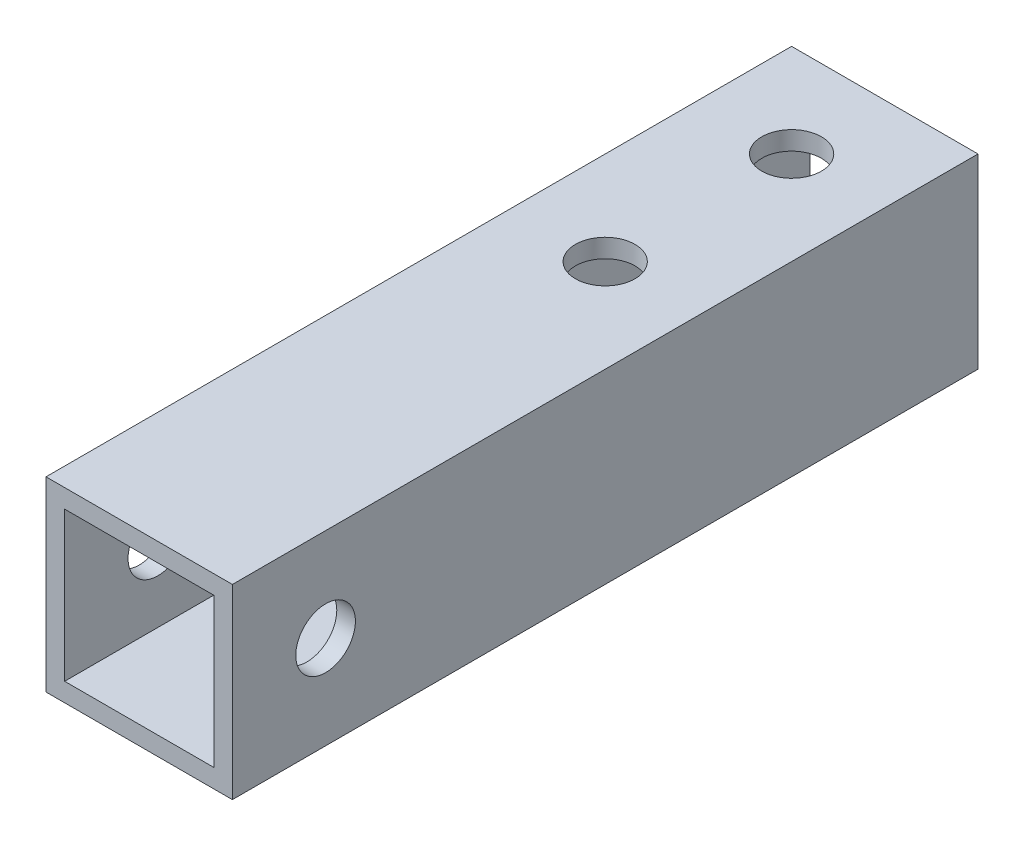
ISO-10303-21;
HEADER;
FILE_DESCRIPTION(('STEP AP214'),'2;1');
FILE_NAME('part.step','',(''),(''),'','','');
FILE_SCHEMA(('AUTOMOTIVE_DESIGN { 1 0 10303 214 1 1 1 1 }'));
ENDSEC;
DATA;
#1=APPLICATION_CONTEXT('core data for automotive mechanical design processes');
#2=APPLICATION_PROTOCOL_DEFINITION('international standard','automotive_design',2000,#1);
#3=PRODUCT_CONTEXT('',#1,'mechanical');
#4=PRODUCT('Part','Part','',(#3));
#5=PRODUCT_RELATED_PRODUCT_CATEGORY('part','',(#4));
#6=PRODUCT_DEFINITION_FORMATION('','',#4);
#7=PRODUCT_DEFINITION_CONTEXT('part definition',#1,'design');
#8=PRODUCT_DEFINITION('design','',#6,#7);
#9=PRODUCT_DEFINITION_SHAPE('','',#8);
#10=(LENGTH_UNIT() NAMED_UNIT(*) SI_UNIT(.MILLI.,.METRE.));
#11=(NAMED_UNIT(*) PLANE_ANGLE_UNIT() SI_UNIT($,.RADIAN.));
#12=(NAMED_UNIT(*) SI_UNIT($,.STERADIAN.) SOLID_ANGLE_UNIT());
#13=UNCERTAINTY_MEASURE_WITH_UNIT(LENGTH_MEASURE(1.E-05),#10,'distance_accuracy_value','');
#14=(GEOMETRIC_REPRESENTATION_CONTEXT(3) GLOBAL_UNCERTAINTY_ASSIGNED_CONTEXT((#13)) GLOBAL_UNIT_ASSIGNED_CONTEXT((#10,
#11,#12)) REPRESENTATION_CONTEXT('',''));
#15=CARTESIAN_POINT('',(0.,0.,0.));
#16=DIRECTION('',(0.,0.,1.));
#17=DIRECTION('',(1.,0.,0.));
#18=AXIS2_PLACEMENT_3D('',#15,#16,#17);
#19=CARTESIAN_POINT('',(0.,0.,40.));
#20=DIRECTION('',(0.,0.,1.));
#21=DIRECTION('',(1.,0.,0.));
#22=AXIS2_PLACEMENT_3D('',#19,#20,#21);
#23=PLANE('',#22);
#24=DIRECTION('',(0.,1.,0.));
#25=VECTOR('',#24,1.);
#26=CARTESIAN_POINT('',(5.,-5.,40.));
#27=LINE('',#26,#25);
#28=CARTESIAN_POINT('',(5.,-5.,40.));
#29=VERTEX_POINT('',#28);
#30=CARTESIAN_POINT('',(5.,5.,40.));
#31=VERTEX_POINT('',#30);
#32=EDGE_CURVE('E164',#29,#31,#27,.T.);
#33=ORIENTED_EDGE('',*,*,#32,.T.);
#34=DIRECTION('',(-1.,0.,0.));
#35=VECTOR('',#34,1.);
#36=CARTESIAN_POINT('',(-5.,5.,40.));
#37=LINE('',#36,#35);
#38=CARTESIAN_POINT('',(-5.,5.,40.));
#39=VERTEX_POINT('',#38);
#40=EDGE_CURVE('E167',#31,#39,#37,.T.);
#41=ORIENTED_EDGE('',*,*,#40,.T.);
#42=DIRECTION('',(0.,-1.,0.));
#43=VECTOR('',#42,1.);
#44=CARTESIAN_POINT('',(-5.,-5.,40.));
#45=LINE('',#44,#43);
#46=CARTESIAN_POINT('',(-5.,-5.,40.));
#47=VERTEX_POINT('',#46);
#48=EDGE_CURVE('E170',#39,#47,#45,.T.);
#49=ORIENTED_EDGE('',*,*,#48,.T.);
#50=DIRECTION('',(1.,0.,0.));
#51=VECTOR('',#50,1.);
#52=CARTESIAN_POINT('',(-5.,-5.,40.));
#53=LINE('',#52,#51);
#54=EDGE_CURVE('E172',#47,#29,#53,.T.);
#55=ORIENTED_EDGE('',*,*,#54,.T.);
#56=EDGE_LOOP('',(#33,#41,#49,#55));
#57=FACE_BOUND('',#56,.T.);
#58=DIRECTION('',(-1.,0.,0.));
#59=VECTOR('',#58,1.);
#60=CARTESIAN_POINT('',(0.,4.,40.));
#61=LINE('',#60,#59);
#62=CARTESIAN_POINT('',(4.,4.,40.));
#63=VERTEX_POINT('',#62);
#64=CARTESIAN_POINT('',(-4.,4.,40.));
#65=VERTEX_POINT('',#64);
#66=EDGE_CURVE('E134',#63,#65,#61,.T.);
#67=ORIENTED_EDGE('',*,*,#66,.F.);
#68=DIRECTION('',(0.,1.,0.));
#69=VECTOR('',#68,1.);
#70=CARTESIAN_POINT('',(4.,0.,40.));
#71=LINE('',#70,#69);
#72=CARTESIAN_POINT('',(4.,-4.,40.));
#73=VERTEX_POINT('',#72);
#74=EDGE_CURVE('E126',#73,#63,#71,.T.);
#75=ORIENTED_EDGE('',*,*,#74,.F.);
#76=DIRECTION('',(1.,0.,0.));
#77=VECTOR('',#76,1.);
#78=CARTESIAN_POINT('',(0.,-4.,40.));
#79=LINE('',#78,#77);
#80=CARTESIAN_POINT('',(-4.,-4.,40.));
#81=VERTEX_POINT('',#80);
#82=EDGE_CURVE('E148',#81,#73,#79,.T.);
#83=ORIENTED_EDGE('',*,*,#82,.F.);
#84=DIRECTION('',(0.,-1.,0.));
#85=VECTOR('',#84,1.);
#86=CARTESIAN_POINT('',(-4.,0.,40.));
#87=LINE('',#86,#85);
#88=EDGE_CURVE('E146',#65,#81,#87,.T.);
#89=ORIENTED_EDGE('',*,*,#88,.F.);
#90=EDGE_LOOP('',(#67,#75,#83,#89));
#91=FACE_BOUND('',#90,.T.);
#92=ADVANCED_FACE('F59',(#57,#91),#23,.T.);
#93=CARTESIAN_POINT('',(0.,0.,0.));
#94=DIRECTION('',(0.,0.,1.));
#95=DIRECTION('',(1.,0.,0.));
#96=AXIS2_PLACEMENT_3D('',#93,#94,#95);
#97=PLANE('',#96);
#98=DIRECTION('',(0.,1.,0.));
#99=VECTOR('',#98,1.);
#100=CARTESIAN_POINT('',(5.,-5.,0.));
#101=LINE('',#100,#99);
#102=CARTESIAN_POINT('',(5.,-5.,0.));
#103=VERTEX_POINT('',#102);
#104=CARTESIAN_POINT('',(5.,5.,0.));
#105=VERTEX_POINT('',#104);
#106=EDGE_CURVE('E142',#103,#105,#101,.T.);
#107=ORIENTED_EDGE('',*,*,#106,.F.);
#108=DIRECTION('',(1.,0.,0.));
#109=VECTOR('',#108,1.);
#110=CARTESIAN_POINT('',(-5.,-5.,0.));
#111=LINE('',#110,#109);
#112=CARTESIAN_POINT('',(-5.,-5.,0.));
#113=VERTEX_POINT('',#112);
#114=EDGE_CURVE('E168',#113,#103,#111,.T.);
#115=ORIENTED_EDGE('',*,*,#114,.F.);
#116=DIRECTION('',(0.,-1.,0.));
#117=VECTOR('',#116,1.);
#118=CARTESIAN_POINT('',(-5.,-5.,0.));
#119=LINE('',#118,#117);
#120=CARTESIAN_POINT('',(-5.,5.,0.));
#121=VERTEX_POINT('',#120);
#122=EDGE_CURVE('E179',#121,#113,#119,.T.);
#123=ORIENTED_EDGE('',*,*,#122,.F.);
#124=DIRECTION('',(-1.,0.,0.));
#125=VECTOR('',#124,1.);
#126=CARTESIAN_POINT('',(-5.,5.,0.));
#127=LINE('',#126,#125);
#128=EDGE_CURVE('E177',#105,#121,#127,.T.);
#129=ORIENTED_EDGE('',*,*,#128,.F.);
#130=EDGE_LOOP('',(#107,#115,#123,#129));
#131=FACE_BOUND('',#130,.T.);
#132=DIRECTION('',(0.,1.,0.));
#133=VECTOR('',#132,1.);
#134=CARTESIAN_POINT('',(4.,0.,0.));
#135=LINE('',#134,#133);
#136=CARTESIAN_POINT('',(4.,-4.,0.));
#137=VERTEX_POINT('',#136);
#138=CARTESIAN_POINT('',(4.,4.,0.));
#139=VERTEX_POINT('',#138);
#140=EDGE_CURVE('E84',#137,#139,#135,.T.);
#141=ORIENTED_EDGE('',*,*,#140,.T.);
#142=DIRECTION('',(-1.,0.,0.));
#143=VECTOR('',#142,1.);
#144=CARTESIAN_POINT('',(0.,4.,0.));
#145=LINE('',#144,#143);
#146=CARTESIAN_POINT('',(-4.,4.,0.));
#147=VERTEX_POINT('',#146);
#148=EDGE_CURVE('E141',#139,#147,#145,.T.);
#149=ORIENTED_EDGE('',*,*,#148,.T.);
#150=DIRECTION('',(0.,-1.,0.));
#151=VECTOR('',#150,1.);
#152=CARTESIAN_POINT('',(-4.,0.,0.));
#153=LINE('',#152,#151);
#154=CARTESIAN_POINT('',(-4.,-4.,0.));
#155=VERTEX_POINT('',#154);
#156=EDGE_CURVE('E156',#147,#155,#153,.T.);
#157=ORIENTED_EDGE('',*,*,#156,.T.);
#158=DIRECTION('',(1.,0.,0.));
#159=VECTOR('',#158,1.);
#160=CARTESIAN_POINT('',(0.,-4.,0.));
#161=LINE('',#160,#159);
#162=EDGE_CURVE('E135',#155,#137,#161,.T.);
#163=ORIENTED_EDGE('',*,*,#162,.T.);
#164=EDGE_LOOP('',(#141,#149,#157,#163));
#165=FACE_BOUND('',#164,.T.);
#166=ADVANCED_FACE('F237',(#131,#165),#97,.F.);
#167=CARTESIAN_POINT('',(5.,-5.,40.));
#168=DIRECTION('',(-1.,0.,0.));
#169=DIRECTION('',(0.,0.,1.));
#170=AXIS2_PLACEMENT_3D('',#167,#168,#169);
#171=PLANE('',#170);
#172=CARTESIAN_POINT('',(5.,0.,35.));
#173=DIRECTION('',(1.,0.,0.));
#174=DIRECTION('',(0.,0.,-1.));
#175=AXIS2_PLACEMENT_3D('',#172,#173,#174);
#176=CIRCLE('',#175,1.60000000000001);
#177=CARTESIAN_POINT('',(5.,0.,33.4));
#178=VERTEX_POINT('',#177);
#179=EDGE_CURVE('E217',#178,#178,#176,.T.);
#180=ORIENTED_EDGE('',*,*,#179,.F.);
#181=EDGE_LOOP('',(#180));
#182=FACE_BOUND('',#181,.T.);
#183=ORIENTED_EDGE('',*,*,#106,.T.);
#184=DIRECTION('',(0.,0.,-1.));
#185=VECTOR('',#184,1.);
#186=CARTESIAN_POINT('',(5.,5.,40.));
#187=LINE('',#186,#185);
#188=EDGE_CURVE('E12',#31,#105,#187,.T.);
#189=ORIENTED_EDGE('',*,*,#188,.F.);
#190=ORIENTED_EDGE('',*,*,#32,.F.);
#191=DIRECTION('',(0.,0.,-1.));
#192=VECTOR('',#191,1.);
#193=CARTESIAN_POINT('',(5.,-5.,40.));
#194=LINE('',#193,#192);
#195=EDGE_CURVE('E174',#29,#103,#194,.T.);
#196=ORIENTED_EDGE('',*,*,#195,.T.);
#197=EDGE_LOOP('',(#183,#189,#190,#196));
#198=FACE_BOUND('',#197,.T.);
#199=ADVANCED_FACE('F61',(#182,#198),#171,.F.);
#200=CARTESIAN_POINT('',(-5.,5.,40.));
#201=DIRECTION('',(0.,-1.,0.));
#202=DIRECTION('',(0.,0.,-1.));
#203=AXIS2_PLACEMENT_3D('',#200,#201,#202);
#204=PLANE('',#203);
#205=CARTESIAN_POINT('',(0.,5.,5.));
#206=DIRECTION('',(0.,1.,0.));
#207=DIRECTION('',(0.,0.,1.));
#208=AXIS2_PLACEMENT_3D('',#205,#206,#207);
#209=CIRCLE('',#208,1.6);
#210=CARTESIAN_POINT('',(0.,5.,6.6));
#211=VERTEX_POINT('',#210);
#212=EDGE_CURVE('E210',#211,#211,#209,.T.);
#213=ORIENTED_EDGE('',*,*,#212,.F.);
#214=EDGE_LOOP('',(#213));
#215=FACE_BOUND('',#214,.T.);
#216=CARTESIAN_POINT('',(0.,5.,15.));
#217=DIRECTION('',(0.,1.,0.));
#218=DIRECTION('',(0.,0.,1.));
#219=AXIS2_PLACEMENT_3D('',#216,#217,#218);
#220=CIRCLE('',#219,1.6);
#221=CARTESIAN_POINT('',(0.,5.,16.6));
#222=VERTEX_POINT('',#221);
#223=EDGE_CURVE('E203',#222,#222,#220,.T.);
#224=ORIENTED_EDGE('',*,*,#223,.F.);
#225=EDGE_LOOP('',(#224));
#226=FACE_BOUND('',#225,.T.);
#227=ORIENTED_EDGE('',*,*,#128,.T.);
#228=DIRECTION('',(0.,0.,-1.));
#229=VECTOR('',#228,1.);
#230=CARTESIAN_POINT('',(-5.,5.,40.));
#231=LINE('',#230,#229);
#232=EDGE_CURVE('E68',#39,#121,#231,.T.);
#233=ORIENTED_EDGE('',*,*,#232,.F.);
#234=ORIENTED_EDGE('',*,*,#40,.F.);
#235=ORIENTED_EDGE('',*,*,#188,.T.);
#236=EDGE_LOOP('',(#227,#233,#234,#235));
#237=FACE_BOUND('',#236,.T.);
#238=ADVANCED_FACE('F267',(#215,#226,#237),#204,.F.);
#239=CARTESIAN_POINT('',(-5.,-5.,40.));
#240=DIRECTION('',(1.,0.,0.));
#241=DIRECTION('',(0.,0.,-1.));
#242=AXIS2_PLACEMENT_3D('',#239,#240,#241);
#243=PLANE('',#242);
#244=CARTESIAN_POINT('',(-5.,0.,35.));
#245=DIRECTION('',(1.,0.,0.));
#246=DIRECTION('',(0.,0.,-1.));
#247=AXIS2_PLACEMENT_3D('',#244,#245,#246);
#248=CIRCLE('',#247,1.60000000000001);
#249=CARTESIAN_POINT('',(-5.,0.,33.4));
#250=VERTEX_POINT('',#249);
#251=EDGE_CURVE('E220',#250,#250,#248,.T.);
#252=ORIENTED_EDGE('',*,*,#251,.T.);
#253=EDGE_LOOP('',(#252));
#254=FACE_BOUND('',#253,.T.);
#255=ORIENTED_EDGE('',*,*,#122,.T.);
#256=DIRECTION('',(0.,0.,-1.));
#257=VECTOR('',#256,1.);
#258=CARTESIAN_POINT('',(-5.,-5.,40.));
#259=LINE('',#258,#257);
#260=EDGE_CURVE('E184',#47,#113,#259,.T.);
#261=ORIENTED_EDGE('',*,*,#260,.F.);
#262=ORIENTED_EDGE('',*,*,#48,.F.);
#263=ORIENTED_EDGE('',*,*,#232,.T.);
#264=EDGE_LOOP('',(#255,#261,#262,#263));
#265=FACE_BOUND('',#264,.T.);
#266=ADVANCED_FACE('F264',(#254,#265),#243,.F.);
#267=CARTESIAN_POINT('',(-5.,-5.,40.));
#268=DIRECTION('',(0.,1.,0.));
#269=DIRECTION('',(0.,0.,1.));
#270=AXIS2_PLACEMENT_3D('',#267,#268,#269);
#271=PLANE('',#270);
#272=CARTESIAN_POINT('',(0.,-5.,5.));
#273=DIRECTION('',(0.,1.,0.));
#274=DIRECTION('',(0.,0.,1.));
#275=AXIS2_PLACEMENT_3D('',#272,#273,#274);
#276=CIRCLE('',#275,1.6);
#277=CARTESIAN_POINT('',(0.,-5.,6.6));
#278=VERTEX_POINT('',#277);
#279=EDGE_CURVE('E192',#278,#278,#276,.T.);
#280=ORIENTED_EDGE('',*,*,#279,.T.);
#281=EDGE_LOOP('',(#280));
#282=FACE_BOUND('',#281,.T.);
#283=CARTESIAN_POINT('',(0.,-5.,15.));
#284=DIRECTION('',(0.,1.,0.));
#285=DIRECTION('',(0.,0.,1.));
#286=AXIS2_PLACEMENT_3D('',#283,#284,#285);
#287=CIRCLE('',#286,1.6);
#288=CARTESIAN_POINT('',(0.,-5.,16.6));
#289=VERTEX_POINT('',#288);
#290=EDGE_CURVE('E206',#289,#289,#287,.T.);
#291=ORIENTED_EDGE('',*,*,#290,.T.);
#292=EDGE_LOOP('',(#291));
#293=FACE_BOUND('',#292,.T.);
#294=ORIENTED_EDGE('',*,*,#114,.T.);
#295=ORIENTED_EDGE('',*,*,#195,.F.);
#296=ORIENTED_EDGE('',*,*,#54,.F.);
#297=ORIENTED_EDGE('',*,*,#260,.T.);
#298=EDGE_LOOP('',(#294,#295,#296,#297));
#299=FACE_BOUND('',#298,.T.);
#300=ADVANCED_FACE('F261',(#282,#293,#299),#271,.F.);
#301=CARTESIAN_POINT('',(4.,0.,40.));
#302=DIRECTION('',(-1.,0.,0.));
#303=DIRECTION('',(0.,0.,1.));
#304=AXIS2_PLACEMENT_3D('',#301,#302,#303);
#305=PLANE('',#304);
#306=CARTESIAN_POINT('',(4.,0.,35.));
#307=DIRECTION('',(-1.,0.,0.));
#308=DIRECTION('',(0.,0.,1.));
#309=AXIS2_PLACEMENT_3D('',#306,#307,#308);
#310=CIRCLE('',#309,1.60000000000001);
#311=CARTESIAN_POINT('',(4.,0.,36.6));
#312=VERTEX_POINT('',#311);
#313=EDGE_CURVE('E207',#312,#312,#310,.T.);
#314=ORIENTED_EDGE('',*,*,#313,.F.);
#315=EDGE_LOOP('',(#314));
#316=FACE_BOUND('',#315,.T.);
#317=ORIENTED_EDGE('',*,*,#140,.F.);
#318=DIRECTION('',(0.,0.,-1.));
#319=VECTOR('',#318,1.);
#320=CARTESIAN_POINT('',(4.,-4.,40.));
#321=LINE('',#320,#319);
#322=EDGE_CURVE('E130',#73,#137,#321,.T.);
#323=ORIENTED_EDGE('',*,*,#322,.F.);
#324=ORIENTED_EDGE('',*,*,#74,.T.);
#325=DIRECTION('',(0.,0.,-1.));
#326=VECTOR('',#325,1.);
#327=CARTESIAN_POINT('',(4.,4.,40.));
#328=LINE('',#327,#326);
#329=EDGE_CURVE('E129',#63,#139,#328,.T.);
#330=ORIENTED_EDGE('',*,*,#329,.T.);
#331=EDGE_LOOP('',(#317,#323,#324,#330));
#332=FACE_BOUND('',#331,.T.);
#333=ADVANCED_FACE('F128',(#316,#332),#305,.T.);
#334=CARTESIAN_POINT('',(0.,4.,40.));
#335=DIRECTION('',(0.,-1.,0.));
#336=DIRECTION('',(0.,0.,-1.));
#337=AXIS2_PLACEMENT_3D('',#334,#335,#336);
#338=PLANE('',#337);
#339=CARTESIAN_POINT('',(0.,4.,5.));
#340=DIRECTION('',(0.,-1.,0.));
#341=DIRECTION('',(0.,0.,-1.));
#342=AXIS2_PLACEMENT_3D('',#339,#340,#341);
#343=CIRCLE('',#342,1.6);
#344=CARTESIAN_POINT('',(0.,4.,3.4));
#345=VERTEX_POINT('',#344);
#346=EDGE_CURVE('E154',#345,#345,#343,.T.);
#347=ORIENTED_EDGE('',*,*,#346,.F.);
#348=EDGE_LOOP('',(#347));
#349=FACE_BOUND('',#348,.T.);
#350=CARTESIAN_POINT('',(0.,4.,15.));
#351=DIRECTION('',(0.,-1.,0.));
#352=DIRECTION('',(0.,0.,-1.));
#353=AXIS2_PLACEMENT_3D('',#350,#351,#352);
#354=CIRCLE('',#353,1.6);
#355=CARTESIAN_POINT('',(0.,4.,13.4));
#356=VERTEX_POINT('',#355);
#357=EDGE_CURVE('E191',#356,#356,#354,.T.);
#358=ORIENTED_EDGE('',*,*,#357,.F.);
#359=EDGE_LOOP('',(#358));
#360=FACE_BOUND('',#359,.T.);
#361=ORIENTED_EDGE('',*,*,#148,.F.);
#362=ORIENTED_EDGE('',*,*,#329,.F.);
#363=ORIENTED_EDGE('',*,*,#66,.T.);
#364=DIRECTION('',(0.,0.,-1.));
#365=VECTOR('',#364,1.);
#366=CARTESIAN_POINT('',(-4.,4.,40.));
#367=LINE('',#366,#365);
#368=EDGE_CURVE('E143',#65,#147,#367,.T.);
#369=ORIENTED_EDGE('',*,*,#368,.T.);
#370=EDGE_LOOP('',(#361,#362,#363,#369));
#371=FACE_BOUND('',#370,.T.);
#372=ADVANCED_FACE('F138',(#349,#360,#371),#338,.T.);
#373=CARTESIAN_POINT('',(-4.,0.,40.));
#374=DIRECTION('',(1.,0.,0.));
#375=DIRECTION('',(0.,0.,-1.));
#376=AXIS2_PLACEMENT_3D('',#373,#374,#375);
#377=PLANE('',#376);
#378=CARTESIAN_POINT('',(-4.,0.,35.));
#379=DIRECTION('',(1.,0.,0.));
#380=DIRECTION('',(0.,0.,-1.));
#381=AXIS2_PLACEMENT_3D('',#378,#379,#380);
#382=CIRCLE('',#381,1.60000000000001);
#383=CARTESIAN_POINT('',(-4.,0.,33.4));
#384=VERTEX_POINT('',#383);
#385=EDGE_CURVE('E63',#384,#384,#382,.T.);
#386=ORIENTED_EDGE('',*,*,#385,.F.);
#387=EDGE_LOOP('',(#386));
#388=FACE_BOUND('',#387,.T.);
#389=ORIENTED_EDGE('',*,*,#156,.F.);
#390=ORIENTED_EDGE('',*,*,#368,.F.);
#391=ORIENTED_EDGE('',*,*,#88,.T.);
#392=DIRECTION('',(0.,0.,-1.));
#393=VECTOR('',#392,1.);
#394=CARTESIAN_POINT('',(-4.,-4.,40.));
#395=LINE('',#394,#393);
#396=EDGE_CURVE('E76',#81,#155,#395,.T.);
#397=ORIENTED_EDGE('',*,*,#396,.T.);
#398=EDGE_LOOP('',(#389,#390,#391,#397));
#399=FACE_BOUND('',#398,.T.);
#400=ADVANCED_FACE('F230',(#388,#399),#377,.T.);
#401=CARTESIAN_POINT('',(0.,-4.,40.));
#402=DIRECTION('',(0.,1.,0.));
#403=DIRECTION('',(0.,0.,1.));
#404=AXIS2_PLACEMENT_3D('',#401,#402,#403);
#405=PLANE('',#404);
#406=CARTESIAN_POINT('',(0.,-4.,5.));
#407=DIRECTION('',(0.,1.,0.));
#408=DIRECTION('',(0.,0.,1.));
#409=AXIS2_PLACEMENT_3D('',#406,#407,#408);
#410=CIRCLE('',#409,1.6);
#411=CARTESIAN_POINT('',(0.,-4.,6.6));
#412=VERTEX_POINT('',#411);
#413=EDGE_CURVE('E193',#412,#412,#410,.T.);
#414=ORIENTED_EDGE('',*,*,#413,.F.);
#415=EDGE_LOOP('',(#414));
#416=FACE_BOUND('',#415,.T.);
#417=CARTESIAN_POINT('',(0.,-4.,15.));
#418=DIRECTION('',(0.,1.,0.));
#419=DIRECTION('',(0.,0.,1.));
#420=AXIS2_PLACEMENT_3D('',#417,#418,#419);
#421=CIRCLE('',#420,1.6);
#422=CARTESIAN_POINT('',(0.,-4.,16.6));
#423=VERTEX_POINT('',#422);
#424=EDGE_CURVE('E189',#423,#423,#421,.T.);
#425=ORIENTED_EDGE('',*,*,#424,.F.);
#426=EDGE_LOOP('',(#425));
#427=FACE_BOUND('',#426,.T.);
#428=ORIENTED_EDGE('',*,*,#162,.F.);
#429=ORIENTED_EDGE('',*,*,#396,.F.);
#430=ORIENTED_EDGE('',*,*,#82,.T.);
#431=ORIENTED_EDGE('',*,*,#322,.T.);
#432=EDGE_LOOP('',(#428,#429,#430,#431));
#433=FACE_BOUND('',#432,.T.);
#434=ADVANCED_FACE('F233',(#416,#427,#433),#405,.T.);
#435=CARTESIAN_POINT('',(0.,-5.,15.));
#436=DIRECTION('',(0.,1.,0.));
#437=DIRECTION('',(0.,0.,1.));
#438=AXIS2_PLACEMENT_3D('',#435,#436,#437);
#439=CYLINDRICAL_SURFACE('',#438,1.6);
#440=ORIENTED_EDGE('',*,*,#424,.T.);
#441=EDGE_LOOP('',(#440));
#442=FACE_BOUND('',#441,.T.);
#443=ORIENTED_EDGE('',*,*,#290,.F.);
#444=EDGE_LOOP('',(#443));
#445=FACE_BOUND('',#444,.T.);
#446=ADVANCED_FACE('F239',(#442,#445),#439,.F.);
#447=CARTESIAN_POINT('',(0.,-5.,5.));
#448=DIRECTION('',(0.,1.,0.));
#449=DIRECTION('',(0.,0.,1.));
#450=AXIS2_PLACEMENT_3D('',#447,#448,#449);
#451=CYLINDRICAL_SURFACE('',#450,1.6);
#452=ORIENTED_EDGE('',*,*,#413,.T.);
#453=EDGE_LOOP('',(#452));
#454=FACE_BOUND('',#453,.T.);
#455=ORIENTED_EDGE('',*,*,#279,.F.);
#456=EDGE_LOOP('',(#455));
#457=FACE_BOUND('',#456,.T.);
#458=ADVANCED_FACE('F245',(#454,#457),#451,.F.);
#459=ORIENTED_EDGE('',*,*,#357,.T.);
#460=EDGE_LOOP('',(#459));
#461=FACE_BOUND('',#460,.T.);
#462=ORIENTED_EDGE('',*,*,#223,.T.);
#463=EDGE_LOOP('',(#462));
#464=FACE_BOUND('',#463,.T.);
#465=ADVANCED_FACE('F248',(#461,#464),#439,.F.);
#466=ORIENTED_EDGE('',*,*,#346,.T.);
#467=EDGE_LOOP('',(#466));
#468=FACE_BOUND('',#467,.T.);
#469=ORIENTED_EDGE('',*,*,#212,.T.);
#470=EDGE_LOOP('',(#469));
#471=FACE_BOUND('',#470,.T.);
#472=ADVANCED_FACE('F293',(#468,#471),#451,.F.);
#473=CARTESIAN_POINT('',(-5.,0.,35.));
#474=DIRECTION('',(1.,0.,0.));
#475=DIRECTION('',(0.,0.,-1.));
#476=AXIS2_PLACEMENT_3D('',#473,#474,#475);
#477=CYLINDRICAL_SURFACE('',#476,1.60000000000001);
#478=ORIENTED_EDGE('',*,*,#385,.T.);
#479=EDGE_LOOP('',(#478));
#480=FACE_BOUND('',#479,.T.);
#481=ORIENTED_EDGE('',*,*,#251,.F.);
#482=EDGE_LOOP('',(#481));
#483=FACE_BOUND('',#482,.T.);
#484=ADVANCED_FACE('F227',(#480,#483),#477,.F.);
#485=ORIENTED_EDGE('',*,*,#313,.T.);
#486=EDGE_LOOP('',(#485));
#487=FACE_BOUND('',#486,.T.);
#488=ORIENTED_EDGE('',*,*,#179,.T.);
#489=EDGE_LOOP('',(#488));
#490=FACE_BOUND('',#489,.T.);
#491=ADVANCED_FACE('F302',(#487,#490),#477,.F.);
#492=CLOSED_SHELL('',(#92,#166,#199,#238,#266,#300,#333,#372,#400,#434,#446,#458,#465,#472,#484,#491));
#493=MANIFOLD_SOLID_BREP('B2',#492);
#494=ADVANCED_BREP_SHAPE_REPRESENTATION('',(#18,#493),#14);
#495=SHAPE_DEFINITION_REPRESENTATION(#9,#494);
ENDSEC;
END-ISO-10303-21;
